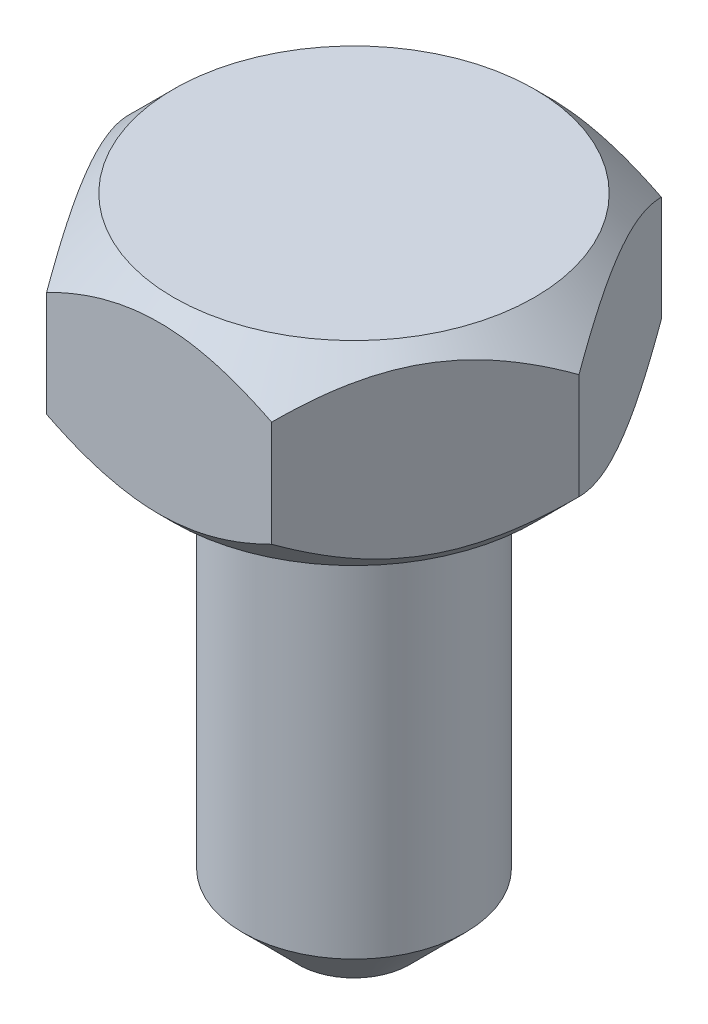
ISO-10303-21;
HEADER;
FILE_DESCRIPTION(('STEP AP214'),'2;1');
FILE_NAME('part.step','',(''),(''),'','','');
FILE_SCHEMA(('AUTOMOTIVE_DESIGN { 1 0 10303 214 1 1 1 1 }'));
ENDSEC;
DATA;
#1=APPLICATION_CONTEXT('core data for automotive mechanical design processes');
#2=APPLICATION_PROTOCOL_DEFINITION('international standard','automotive_design',2000,#1);
#3=PRODUCT_CONTEXT('',#1,'mechanical');
#4=PRODUCT('Part','Part','',(#3));
#5=PRODUCT_RELATED_PRODUCT_CATEGORY('part','',(#4));
#6=PRODUCT_DEFINITION_FORMATION('','',#4);
#7=PRODUCT_DEFINITION_CONTEXT('part definition',#1,'design');
#8=PRODUCT_DEFINITION('design','',#6,#7);
#9=PRODUCT_DEFINITION_SHAPE('','',#8);
#10=(LENGTH_UNIT() NAMED_UNIT(*) SI_UNIT(.MILLI.,.METRE.));
#11=(NAMED_UNIT(*) PLANE_ANGLE_UNIT() SI_UNIT($,.RADIAN.));
#12=(NAMED_UNIT(*) SI_UNIT($,.STERADIAN.) SOLID_ANGLE_UNIT());
#13=UNCERTAINTY_MEASURE_WITH_UNIT(LENGTH_MEASURE(1.E-05),#10,'distance_accuracy_value','');
#14=(GEOMETRIC_REPRESENTATION_CONTEXT(3) GLOBAL_UNCERTAINTY_ASSIGNED_CONTEXT((#13)) GLOBAL_UNIT_ASSIGNED_CONTEXT((#10,
#11,#12)) REPRESENTATION_CONTEXT('',''));
#15=CARTESIAN_POINT('',(0.,0.,0.));
#16=DIRECTION('',(0.,0.,1.));
#17=DIRECTION('',(1.,0.,0.));
#18=AXIS2_PLACEMENT_3D('',#15,#16,#17);
#19=CARTESIAN_POINT('',(-4.04145188432739,-3.5,0.));
#20=DIRECTION('',(0.,1.,0.));
#21=DIRECTION('',(0.,0.,1.));
#22=AXIS2_PLACEMENT_3D('',#19,#20,#21);
#23=PLANE('',#22);
#24=CARTESIAN_POINT('',(0.,-3.5,0.));
#25=DIRECTION('',(0.,1.,0.));
#26=DIRECTION('',(0.,0.,1.));
#27=AXIS2_PLACEMENT_3D('',#24,#25,#26);
#28=CIRCLE('',#27,3.24145188432739);
#29=CARTESIAN_POINT('',(0.,-3.5,3.24145188432739));
#30=VERTEX_POINT('',#29);
#31=EDGE_CURVE('E102',#30,#30,#28,.T.);
#32=ORIENTED_EDGE('',*,*,#31,.F.);
#33=EDGE_LOOP('',(#32));
#34=FACE_BOUND('',#33,.T.);
#35=CARTESIAN_POINT('',(0.,-3.5,0.));
#36=DIRECTION('',(0.,1.,0.));
#37=DIRECTION('',(0.,0.,1.));
#38=AXIS2_PLACEMENT_3D('',#35,#36,#37);
#39=CIRCLE('',#38,2.);
#40=CARTESIAN_POINT('',(0.,-3.5,2.));
#41=VERTEX_POINT('',#40);
#42=EDGE_CURVE('E117',#41,#41,#39,.F.);
#43=ORIENTED_EDGE('',*,*,#42,.F.);
#44=EDGE_LOOP('',(#43));
#45=FACE_BOUND('',#44,.T.);
#46=ADVANCED_FACE('F29',(#34,#45),#23,.F.);
#47=CARTESIAN_POINT('',(0.,-11.5,0.));
#48=DIRECTION('',(0.,1.,0.));
#49=DIRECTION('',(0.,0.,1.));
#50=AXIS2_PLACEMENT_3D('',#47,#48,#49);
#51=CYLINDRICAL_SURFACE('',#50,2.);
#52=CARTESIAN_POINT('',(0.,-10.5,0.));
#53=DIRECTION('',(0.,-1.,0.));
#54=DIRECTION('',(0.,0.,-1.));
#55=AXIS2_PLACEMENT_3D('',#52,#53,#54);
#56=CIRCLE('',#55,2.);
#57=CARTESIAN_POINT('',(0.,-10.5,-2.));
#58=VERTEX_POINT('',#57);
#59=EDGE_CURVE('E42',#58,#58,#56,.F.);
#60=ORIENTED_EDGE('',*,*,#59,.T.);
#61=EDGE_LOOP('',(#60));
#62=FACE_BOUND('',#61,.T.);
#63=ORIENTED_EDGE('',*,*,#42,.T.);
#64=EDGE_LOOP('',(#63));
#65=FACE_BOUND('',#64,.T.);
#66=ADVANCED_FACE('F126',(#62,#65),#51,.T.);
#67=CARTESIAN_POINT('',(0.,-11.5,0.));
#68=DIRECTION('',(0.,-1.,0.));
#69=DIRECTION('',(0.,0.,-1.));
#70=AXIS2_PLACEMENT_3D('',#67,#68,#69);
#71=PLANE('',#70);
#72=CARTESIAN_POINT('',(0.,-11.5,0.));
#73=DIRECTION('',(0.,-1.,0.));
#74=DIRECTION('',(0.,0.,-1.));
#75=AXIS2_PLACEMENT_3D('',#72,#73,#74);
#76=CIRCLE('',#75,0.999999999999999);
#77=CARTESIAN_POINT('',(0.,-11.5,-0.999999999999999));
#78=VERTEX_POINT('',#77);
#79=EDGE_CURVE('E120',#78,#78,#76,.T.);
#80=ORIENTED_EDGE('',*,*,#79,.T.);
#81=EDGE_LOOP('',(#80));
#82=FACE_BOUND('',#81,.T.);
#83=ADVANCED_FACE('F132',(#82),#71,.T.);
#84=CARTESIAN_POINT('',(0.,-11.5,0.));
#85=DIRECTION('',(0.,1.,0.));
#86=DIRECTION('',(0.,0.,1.));
#87=AXIS2_PLACEMENT_3D('',#84,#85,#86);
#88=CONICAL_SURFACE('',#87,0.999999999999999,0.785398163397447);
#89=ORIENTED_EDGE('',*,*,#59,.F.);
#90=EDGE_LOOP('',(#89));
#91=FACE_BOUND('',#90,.T.);
#92=ORIENTED_EDGE('',*,*,#79,.F.);
#93=EDGE_LOOP('',(#92));
#94=FACE_BOUND('',#93,.T.);
#95=ADVANCED_FACE('F129',(#91,#94),#88,.T.);
#96=CARTESIAN_POINT('',(0.,-3.5,0.));
#97=DIRECTION('',(0.,1.,0.));
#98=DIRECTION('',(0.,0.,1.));
#99=AXIS2_PLACEMENT_3D('',#96,#97,#98);
#100=CONICAL_SURFACE('',#99,3.24145188432739,0.785398163397448);
#101=CARTESIAN_POINT('',(-4.04156735438123,-2.69988452499759,0.000200000000024374));
#102=CARTESIAN_POINT('',(-3.97210706066971,-2.76928406626867,-0.120108757816985));
#103=CARTESIAN_POINT('',(-3.90148531215406,-2.83460752114448,-0.242429214365436));
#104=CARTESIAN_POINT('',(-3.75747991147154,-2.95421294831347,-0.491853884911885));
#105=CARTESIAN_POINT('',(-3.68408256574986,-3.00842837712061,-0.618981816842531));
#106=CARTESIAN_POINT('',(-3.53608035685404,-3.10130032476617,-0.875329162282505));
#107=CARTESIAN_POINT('',(-3.4615131811703,-3.14019025979249,-1.00448329914366));
#108=CARTESIAN_POINT('',(-3.310737295381,-3.20010809560693,-1.26563479388693));
#109=CARTESIAN_POINT('',(-3.2345331906662,-3.22118071965238,-1.39762417499826));
#110=CARTESIAN_POINT('',(-3.10319782183118,-3.24019388535166,-1.62510370665133));
#111=CARTESIAN_POINT('',(-3.04823615399914,-3.24300830014006,-1.72030010780514));
#112=CARTESIAN_POINT('',(-2.93840222621348,-3.23826531256006,-1.91053805112477));
#113=CARTESIAN_POINT('',(-2.88353000435282,-3.23070427424299,-2.00557952731161));
#114=CARTESIAN_POINT('',(-2.77430542200353,-3.20564210374561,-2.19476205337608));
#115=CARTESIAN_POINT('',(-2.71995371223669,-3.1881298536199,-2.28890197617048));
#116=CARTESIAN_POINT('',(-2.61218376551828,-3.14412110260569,-2.47556499941575));
#117=CARTESIAN_POINT('',(-2.55876545732786,-3.11762529053566,-2.56808822325595));
#118=CARTESIAN_POINT('',(-2.46393368006796,-3.06311203056568,-2.73234167964214));
#119=CARTESIAN_POINT('',(-2.42231028209656,-3.03652769615024,-2.80443551971227));
#120=CARTESIAN_POINT('',(-2.33981072759412,-2.97907462503668,-2.94732893971228));
#121=CARTESIAN_POINT('',(-2.29893459386685,-2.94820575783654,-3.01812848014491));
#122=CARTESIAN_POINT('',(-2.21805834837752,-2.88287565935588,-3.15821024645784));
#123=CARTESIAN_POINT('',(-2.17805593632086,-2.84842572434904,-3.22749645656527));
#124=CARTESIAN_POINT('',(-2.09879193666162,-2.77638590028467,-3.36478573118621));
#125=CARTESIAN_POINT('',(-2.05952991236256,-2.73879793793946,-3.43278955208019));
#126=CARTESIAN_POINT('',(-2.02061047210986,-2.69988452499759,-3.5002));
#127=B_SPLINE_CURVE_WITH_KNOTS('',3,(#101,#102,#103,#104,#105,#106,#107,#108,#109,#110,#111,
#112,#113,#114,#115,#116,#117,#118,#119,#120,#121,#122,#123,#124,#125,#126),.UNSPECIFIED.,.F.,
.F.,(4,2,2,2,2,2,2,2,2,2,2,2,4),(0.,0.466195029511836,0.93510605524767,1.39657035229711,
1.85687285909026,2.18628459516077,2.51581179896772,2.845707891424,3.17557869467338,
3.4376213889119,3.69967206642682,3.96091985737579,4.22200840855898),.UNSPECIFIED.);
#128=CARTESIAN_POINT('',(-4.04145188432739,-2.7,0.));
#129=VERTEX_POINT('',#128);
#130=CARTESIAN_POINT('',(-2.02072594216371,-2.7,-3.5));
#131=VERTEX_POINT('',#130);
#132=EDGE_CURVE('E177',#129,#131,#127,.T.);
#133=ORIENTED_EDGE('',*,*,#132,.T.);
#134=CARTESIAN_POINT('',(-4.11343909523356,-1.34049074854832,-3.5));
#135=CARTESIAN_POINT('',(-4.01364790461446,-1.41647576800568,-3.5));
#136=CARTESIAN_POINT('',(-3.91330741187747,-1.4917509457735,-3.5));
#137=CARTESIAN_POINT('',(-3.71130759190236,-1.64056086288985,-3.5));
#138=CARTESIAN_POINT('',(-3.60964794828074,-1.71409517230361,-3.5));
#139=CARTESIAN_POINT('',(-3.40404593483019,-1.85962589901091,-3.5));
#140=CARTESIAN_POINT('',(-3.30009198936034,-1.93160601709034,-3.5));
#141=CARTESIAN_POINT('',(-3.09043455319368,-2.07296300910746,-3.5));
#142=CARTESIAN_POINT('',(-2.98473118535169,-2.14234006473914,-3.5));
#143=CARTESIAN_POINT('',(-2.76489352426084,-2.28196781927053,-3.5));
#144=CARTESIAN_POINT('',(-2.65063360057755,-2.35202171786016,-3.5));
#145=CARTESIAN_POINT('',(-2.41943843809483,-2.48764015461377,-3.5));
#146=CARTESIAN_POINT('',(-2.30250276768208,-2.55320396159193,-3.5));
#147=CARTESIAN_POINT('',(-2.06594770908092,-2.6784356928961,-3.5));
#148=CARTESIAN_POINT('',(-1.94633756764447,-2.73812094705998,-3.5));
#149=CARTESIAN_POINT('',(-1.70380065325271,-2.85025883184051,-3.5));
#150=CARTESIAN_POINT('',(-1.58087544221088,-2.90271479977525,-3.5));
#151=CARTESIAN_POINT('',(-1.34256664054354,-2.99425414604565,-3.5));
#152=CARTESIAN_POINT('',(-1.22748347184254,-3.03411159832747,-3.5));
#153=CARTESIAN_POINT('',(-0.994473602956439,-3.10460445258339,-3.5));
#154=CARTESIAN_POINT('',(-0.876546714407832,-3.13523924184055,-3.5));
#155=CARTESIAN_POINT('',(-0.640555797612561,-3.18515136149643,-3.5));
#156=CARTESIAN_POINT('',(-0.522534731770002,-3.20462846737207,-3.5));
#157=CARTESIAN_POINT('',(-0.285138833258746,-3.23183388871137,-3.5));
#158=CARTESIAN_POINT('',(-0.165764258218942,-3.23956440343576,-3.5));
#159=CARTESIAN_POINT('',(0.0684345425591306,-3.24266430583436,-3.5));
#160=CARTESIAN_POINT('',(0.183252604656246,-3.23850904804464,-3.5));
#161=CARTESIAN_POINT('',(0.41194538139855,-3.21913596089254,-3.5));
#162=CARTESIAN_POINT('',(0.525820005903612,-3.20391708651605,-3.5));
#163=CARTESIAN_POINT('',(0.753728692005361,-3.16300182207144,-3.5));
#164=CARTESIAN_POINT('',(0.867729673651151,-3.13712416826838,-3.5));
#165=CARTESIAN_POINT('',(1.09323660944141,-3.07629621041035,-3.5));
#166=CARTESIAN_POINT('',(1.20474274230377,-3.04134655850057,-3.5));
#167=CARTESIAN_POINT('',(1.43351745819777,-2.96089193875029,-3.5));
#168=CARTESIAN_POINT('',(1.55057121674902,-2.91478260530312,-3.5));
#169=CARTESIAN_POINT('',(1.78163768388521,-2.81546896217881,-3.5));
#170=CARTESIAN_POINT('',(1.8956493792125,-2.76226232305919,-3.5));
#171=CARTESIAN_POINT('',(2.12120309504484,-2.65000927106598,-3.5));
#172=CARTESIAN_POINT('',(2.23273581617762,-2.59094432351664,-3.5));
#173=CARTESIAN_POINT('',(2.45323999840432,-2.46828035973536,-3.5));
#174=CARTESIAN_POINT('',(2.56221185705048,-2.40468205353482,-3.5));
#175=CARTESIAN_POINT('',(2.77258648527557,-2.27708230144591,-3.5));
#176=CARTESIAN_POINT('',(2.87409670716152,-2.21325707762329,-3.5));
#177=CARTESIAN_POINT('',(3.07537374659972,-2.08290631812229,-3.5));
#178=CARTESIAN_POINT('',(3.17514043189724,-2.01638057885912,-3.5));
#179=CARTESIAN_POINT('',(3.37235277259435,-1.88165662424084,-3.5));
#180=CARTESIAN_POINT('',(3.46981066719971,-1.81347626064957,-3.5));
#181=CARTESIAN_POINT('',(3.66339199507936,-1.67530022312019,-3.5));
#182=CARTESIAN_POINT('',(3.75951578844138,-1.60530505424452,-3.5));
#183=CARTESIAN_POINT('',(3.85508044256854,-1.53456747820942,-3.5));
#184=B_SPLINE_CURVE_WITH_KNOTS('',3,(#134,#135,#136,#137,#138,#139,#140,#141,#142,#143,#144,
#145,#146,#147,#148,#149,#150,#151,#152,#153,#154,#155,#156,#157,#158,#159,#160,#161,#162,#163,
#164,#165,#166,#167,#168,#169,#170,#171,#172,#173,#174,#175,#176,#177,#178,#179,#180,#181,#182,
#183),.UNSPECIFIED.,.F.,.F.,(4,2,2,2,2,2,2,2,2,2,2,2,2,2,2,2,2,2,2,2,2,2,2,2,4),(0.,
0.376289066832934,0.752670114666427,1.13196303882771,1.51122943887124,1.91322439656266,
2.31528466194431,2.71612176675466,3.11677320534959,3.48182442073459,3.84689988331699,
4.20521619183289,4.56346540614943,4.90758964289977,5.25174638813573,5.60201478075691,
5.95225800112648,6.32939036689254,6.70664681914763,7.08513741857289,7.46356886710629,
7.82324340751906,8.18294511339456,8.53974109313966,8.89643881996947),.UNSPECIFIED.);
#185=CARTESIAN_POINT('',(2.02072594216368,-2.7,-3.50000000000001));
#186=VERTEX_POINT('',#185);
#187=EDGE_CURVE('E171',#131,#186,#184,.T.);
#188=ORIENTED_EDGE('',*,*,#187,.T.);
#189=CARTESIAN_POINT('',(2.02061047210985,-2.69988452499759,-3.5002));
#190=CARTESIAN_POINT('',(2.09007076582137,-2.76928406626868,-3.37989124218299));
#191=CARTESIAN_POINT('',(2.16069251433702,-2.83460752114448,-3.25757078563454));
#192=CARTESIAN_POINT('',(2.30469791501954,-2.95421294831348,-3.00814611508809));
#193=CARTESIAN_POINT('',(2.37809526074122,-3.00842837712062,-2.88101818315745));
#194=CARTESIAN_POINT('',(2.52609746963704,-3.10130032476618,-2.62467083771748));
#195=CARTESIAN_POINT('',(2.60066464532078,-3.14019025979249,-2.49551670085632));
#196=CARTESIAN_POINT('',(2.75144053111008,-3.20010809560693,-2.23436520611305));
#197=CARTESIAN_POINT('',(2.82764463582487,-3.22118071965239,-2.10237582500172));
#198=CARTESIAN_POINT('',(2.9589800046599,-3.24019388535166,-1.87489629334866));
#199=CARTESIAN_POINT('',(3.01394167249194,-3.24300830014006,-1.77969989219485));
#200=CARTESIAN_POINT('',(3.1237756002776,-3.23826531256006,-1.58946194887522));
#201=CARTESIAN_POINT('',(3.17864782213825,-3.230704274243,-1.49442047268838));
#202=CARTESIAN_POINT('',(3.28787240448755,-3.20564210374561,-1.30523794662391));
#203=CARTESIAN_POINT('',(3.34222411425439,-3.1881298536199,-1.21109802382951));
#204=CARTESIAN_POINT('',(3.4499940609728,-3.14412110260569,-1.02443500058424));
#205=CARTESIAN_POINT('',(3.50341236916322,-3.11762529053566,-0.931911776744044));
#206=CARTESIAN_POINT('',(3.59824414642312,-3.06311203056568,-0.767658320357851));
#207=CARTESIAN_POINT('',(3.63986754439452,-3.03652769615024,-0.695564480287724));
#208=CARTESIAN_POINT('',(3.72236709889696,-2.97907462503668,-0.552671060287705));
#209=CARTESIAN_POINT('',(3.76324323262423,-2.94820575783654,-0.48187151985508));
#210=CARTESIAN_POINT('',(3.84411947811356,-2.88287565935588,-0.34178975354215));
#211=CARTESIAN_POINT('',(3.88412189017022,-2.84842572434904,-0.272503543434717));
#212=CARTESIAN_POINT('',(3.96338588982947,-2.77638590028467,-0.135214268813778));
#213=CARTESIAN_POINT('',(4.00264791412853,-2.73879793793945,-0.0672104479197994));
#214=CARTESIAN_POINT('',(4.04156735438122,-2.69988452499759,0.000200000000013168));
#215=B_SPLINE_CURVE_WITH_KNOTS('',3,(#189,#190,#191,#192,#193,#194,#195,#196,#197,#198,#199,
#200,#201,#202,#203,#204,#205,#206,#207,#208,#209,#210,#211,#212,#213,#214),.UNSPECIFIED.,.F.,
.F.,(4,2,2,2,2,2,2,2,2,2,2,2,4),(0.,0.466195029511833,0.935106055247664,1.3965703522971,
1.85687285909024,2.18628459516076,2.51581179896771,2.84570789142399,3.17557869467336,
3.43762138891188,3.69967206642681,3.96091985737578,4.22200840855897),.UNSPECIFIED.);
#216=CARTESIAN_POINT('',(4.04145188432739,-2.7,0.));
#217=VERTEX_POINT('',#216);
#218=EDGE_CURVE('E90',#186,#217,#215,.T.);
#219=ORIENTED_EDGE('',*,*,#218,.T.);
#220=CARTESIAN_POINT('',(4.04156735438122,-2.69988452499759,-0.000199999999987047));
#221=CARTESIAN_POINT('',(3.9721070606697,-2.76928406626868,0.120108757817022));
#222=CARTESIAN_POINT('',(3.90148531215406,-2.83460752114448,0.242429214365472));
#223=CARTESIAN_POINT('',(3.75747991147153,-2.95421294831348,0.491853884911919));
#224=CARTESIAN_POINT('',(3.68408256574985,-3.00842837712061,0.618981816842565));
#225=CARTESIAN_POINT('',(3.53608035685403,-3.10130032476617,0.875329162282538));
#226=CARTESIAN_POINT('',(3.46151318117029,-3.14019025979249,1.00448329914369));
#227=CARTESIAN_POINT('',(3.31073729538099,-3.20010809560693,1.26563479388696));
#228=CARTESIAN_POINT('',(3.23453319066619,-3.22118071965239,1.39762417499829));
#229=CARTESIAN_POINT('',(3.10319782183116,-3.24019388535166,1.62510370665136));
#230=CARTESIAN_POINT('',(3.04823615399913,-3.24300830014006,1.72030010780516));
#231=CARTESIAN_POINT('',(2.93840222621346,-3.23826531256006,1.91053805112479));
#232=CARTESIAN_POINT('',(2.88353000435281,-3.230704274243,2.00557952731163));
#233=CARTESIAN_POINT('',(2.77430542200351,-3.20564210374561,2.19476205337611));
#234=CARTESIAN_POINT('',(2.71995371223667,-3.1881298536199,2.2889019761705));
#235=CARTESIAN_POINT('',(2.61218376551826,-3.14412110260569,2.47556499941577));
#236=CARTESIAN_POINT('',(2.55876545732783,-3.11762529053566,2.56808822325597));
#237=CARTESIAN_POINT('',(2.46393368006794,-3.06311203056568,2.73234167964216));
#238=CARTESIAN_POINT('',(2.42231028209654,-3.03652769615024,2.80443551971228));
#239=CARTESIAN_POINT('',(2.3398107275941,-2.97907462503668,2.9473289397123));
#240=CARTESIAN_POINT('',(2.29893459386683,-2.94820575783654,3.01812848014492));
#241=CARTESIAN_POINT('',(2.2180583483775,-2.88287565935588,3.15821024645785));
#242=CARTESIAN_POINT('',(2.17805593632084,-2.84842572434904,3.22749645656528));
#243=CARTESIAN_POINT('',(2.0987919366616,-2.77638590028468,3.36478573118621));
#244=CARTESIAN_POINT('',(2.05952991236254,-2.73879793793947,3.43278955208019));
#245=CARTESIAN_POINT('',(2.02061047210984,-2.6998845249976,3.5002));
#246=B_SPLINE_CURVE_WITH_KNOTS('',3,(#220,#221,#222,#223,#224,#225,#226,#227,#228,#229,#230,
#231,#232,#233,#234,#235,#236,#237,#238,#239,#240,#241,#242,#243,#244,#245),.UNSPECIFIED.,.F.,
.F.,(4,2,2,2,2,2,2,2,2,2,2,2,4),(0.,0.466195029511836,0.93510605524767,1.39657035229711,
1.85687285909025,2.18628459516077,2.51581179896772,2.845707891424,3.17557869467337,
3.43762138891189,3.69967206642681,3.96091985737577,4.22200840855895),.UNSPECIFIED.);
#247=CARTESIAN_POINT('',(2.02072594216371,-2.7,3.5));
#248=VERTEX_POINT('',#247);
#249=EDGE_CURVE('E86',#217,#248,#246,.T.);
#250=ORIENTED_EDGE('',*,*,#249,.T.);
#251=CARTESIAN_POINT('',(-4.11343909532792,-1.34049074847645,3.5));
#252=CARTESIAN_POINT('',(-4.01364790470614,-1.41647576793658,3.5));
#253=CARTESIAN_POINT('',(-3.91330741196645,-1.49175094570717,3.5));
#254=CARTESIAN_POINT('',(-3.71130759198594,-1.64056086282906,3.5));
#255=CARTESIAN_POINT('',(-3.6096479483616,-1.71409517224557,3.5));
#256=CARTESIAN_POINT('',(-3.40404593490552,-1.8596258989584,3.5));
#257=CARTESIAN_POINT('',(-3.30009198943286,-1.9316060170406,3.5));
#258=CARTESIAN_POINT('',(-3.09043455326054,-2.07296300906322,3.5));
#259=CARTESIAN_POINT('',(-2.98473118541569,-2.14234006469764,3.5));
#260=CARTESIAN_POINT('',(-2.76489352431867,-2.28196781923471,3.5));
#261=CARTESIAN_POINT('',(-2.65063360063206,-2.35202171782728,3.5));
#262=CARTESIAN_POINT('',(-2.41943843814258,-2.48764015458666,3.5));
#263=CARTESIAN_POINT('',(-2.3025027677264,-2.55320396156762,3.5));
#264=CARTESIAN_POINT('',(-2.06594770911824,-2.67843569287718,3.5));
#265=CARTESIAN_POINT('',(-1.94633756767823,-2.73812094704364,3.5));
#266=CARTESIAN_POINT('',(-1.70380065327916,-2.85025883182901,3.5));
#267=CARTESIAN_POINT('',(-1.58087544223358,-2.902714799766,3.5));
#268=CARTESIAN_POINT('',(-1.34256664056464,-2.99425414603802,3.5));
#269=CARTESIAN_POINT('',(-1.22748347186597,-3.03411159831963,3.5));
#270=CARTESIAN_POINT('',(-0.994473602984598,-3.10460445257561,3.5));
#271=CARTESIAN_POINT('',(-0.876546714438396,-3.13523924183304,3.5));
#272=CARTESIAN_POINT('',(-0.640555797647857,-3.18515136148999,3.5));
#273=CARTESIAN_POINT('',(-0.522534731807625,-3.20462846736643,3.5));
#274=CARTESIAN_POINT('',(-0.285138833300951,-3.23183388870786,3.5));
#275=CARTESIAN_POINT('',(-0.165764258263403,-3.23956440343358,3.5));
#276=CARTESIAN_POINT('',(0.0684345425106541,-3.24266430583524,3.5));
#277=CARTESIAN_POINT('',(0.183252604606004,-3.23850904804722,3.5));
#278=CARTESIAN_POINT('',(0.411945381344963,-3.21913596089876,3.5));
#279=CARTESIAN_POINT('',(0.525820005848445,-3.20391708652421,3.5));
#280=CARTESIAN_POINT('',(0.753728691947076,-3.16300182208367,3.5));
#281=CARTESIAN_POINT('',(0.867729673591332,-3.13712416828275,3.5));
#282=CARTESIAN_POINT('',(1.09323660937868,-3.07629621042903,3.5));
#283=CARTESIAN_POINT('',(1.20474274223966,-3.04134655852143,3.5));
#284=CARTESIAN_POINT('',(1.4335174581261,-2.96089193877731,3.5));
#285=CARTESIAN_POINT('',(1.5505712166713,-2.9147826053345,3.5));
#286=CARTESIAN_POINT('',(1.78163768379569,-2.81546896221932,3.5));
#287=CARTESIAN_POINT('',(1.89564937911723,-2.76226232310448,3.5));
#288=CARTESIAN_POINT('',(2.12120309493829,-2.65000927112113,3.5));
#289=CARTESIAN_POINT('',(2.23273581606554,-2.59094432357686,3.5));
#290=CARTESIAN_POINT('',(2.45323999828135,-2.46828035980589,3.5));
#291=CARTESIAN_POINT('',(2.56221185692215,-2.40468205361059,3.5));
#292=CARTESIAN_POINT('',(2.77258648513752,-2.27708230153161,3.5));
#293=CARTESIAN_POINT('',(2.87409670701908,-2.21325707771367,3.5));
#294=CARTESIAN_POINT('',(3.07537374644856,-2.08290631822205,3.5));
#295=CARTESIAN_POINT('',(3.17514043174175,-2.01638057896358,3.5));
#296=CARTESIAN_POINT('',(3.37235277243031,-1.88165662435465,3.5));
#297=CARTESIAN_POINT('',(3.46981066703145,-1.81347626076803,3.5));
#298=CARTESIAN_POINT('',(3.66339199490269,-1.67530022324793,3.5));
#299=CARTESIAN_POINT('',(3.75951578826051,-1.60530505437691,3.5));
#300=CARTESIAN_POINT('',(3.85508044238348,-1.53456747834644,3.5));
#301=B_SPLINE_CURVE_WITH_KNOTS('',3,(#251,#252,#253,#254,#255,#256,#257,#258,#259,#260,#261,
#262,#263,#264,#265,#266,#267,#268,#269,#270,#271,#272,#273,#274,#275,#276,#277,#278,#279,#280,
#281,#282,#283,#284,#285,#286,#287,#288,#289,#290,#291,#292,#293,#294,#295,#296,#297,#298,#299,
#300),.UNSPECIFIED.,.F.,.F.,(4,2,2,2,2,2,2,2,2,2,2,2,2,2,2,2,2,2,2,2,2,2,2,2,4),(0.,
0.376289066844382,0.752670114689327,1.13196303886228,1.51122943891747,1.91322439662199,
2.31528466201676,2.7161217668401,3.11677320544801,3.48182442082625,3.84689988340191,
4.20521619191135,4.56346540622143,4.90758964296631,5.25174638819682,5.60201478081209,
5.95225800117576,6.32939036692017,6.70664681915359,7.08513741855706,7.46356886706867,
7.82324340746283,8.1829451133197,8.53974109304643,8.89643881985787),.UNSPECIFIED.);
#302=CARTESIAN_POINT('',(-2.02072594216367,-2.70000000000002,3.5));
#303=VERTEX_POINT('',#302);
#304=EDGE_CURVE('E48',#248,#303,#301,.F.);
#305=ORIENTED_EDGE('',*,*,#304,.T.);
#306=CARTESIAN_POINT('',(-2.02061047210983,-2.69988452499761,3.5002));
#307=CARTESIAN_POINT('',(-2.09007076582135,-2.76928406626869,3.37989124218299));
#308=CARTESIAN_POINT('',(-2.160692514337,-2.83460752114449,3.25757078563455));
#309=CARTESIAN_POINT('',(-2.30469791501952,-2.95421294831349,3.0081461150881));
#310=CARTESIAN_POINT('',(-2.3780952607412,-3.00842837712062,2.88101818315746));
#311=CARTESIAN_POINT('',(-2.52609746963702,-3.10130032476618,2.62467083771749));
#312=CARTESIAN_POINT('',(-2.60066464532076,-3.14019025979249,2.49551670085634));
#313=CARTESIAN_POINT('',(-2.75144053111006,-3.20010809560693,2.23436520611307));
#314=CARTESIAN_POINT('',(-2.82764463582486,-3.22118071965239,2.10237582500175));
#315=CARTESIAN_POINT('',(-2.95898000465988,-3.24019388535166,1.87489629334868));
#316=CARTESIAN_POINT('',(-3.01394167249192,-3.24300830014006,1.77969989219488));
#317=CARTESIAN_POINT('',(-3.12377560027759,-3.23826531256006,1.58946194887525));
#318=CARTESIAN_POINT('',(-3.17864782213824,-3.23070427424299,1.49442047268841));
#319=CARTESIAN_POINT('',(-3.28787240448754,-3.20564210374561,1.30523794662394));
#320=CARTESIAN_POINT('',(-3.34222411425438,-3.1881298536199,1.21109802382954));
#321=CARTESIAN_POINT('',(-3.44999406097279,-3.14412110260569,1.02443500058427));
#322=CARTESIAN_POINT('',(-3.50341236916322,-3.11762529053566,0.931911776744076));
#323=CARTESIAN_POINT('',(-3.59824414642311,-3.06311203056568,0.767658320357883));
#324=CARTESIAN_POINT('',(-3.63986754439451,-3.03652769615024,0.695564480287757));
#325=CARTESIAN_POINT('',(-3.72236709889695,-2.97907462503668,0.552671060287739));
#326=CARTESIAN_POINT('',(-3.76324323262423,-2.94820575783654,0.481871519855115));
#327=CARTESIAN_POINT('',(-3.84411947811356,-2.88287565935587,0.341789753542185));
#328=CARTESIAN_POINT('',(-3.88412189017022,-2.84842572434903,0.272503543434753));
#329=CARTESIAN_POINT('',(-3.96338588982947,-2.77638590028466,0.135214268813814));
#330=CARTESIAN_POINT('',(-4.00264791412853,-2.73879793793945,0.0672104479198363));
#331=CARTESIAN_POINT('',(-4.04156735438123,-2.69988452499759,-0.000199999999975872));
#332=B_SPLINE_CURVE_WITH_KNOTS('',3,(#306,#307,#308,#309,#310,#311,#312,#313,#314,#315,#316,
#317,#318,#319,#320,#321,#322,#323,#324,#325,#326,#327,#328,#329,#330,#331),.UNSPECIFIED.,.F.,
.F.,(4,2,2,2,2,2,2,2,2,2,2,2,4),(0.,0.466195029511828,0.935106055247654,1.39657035229708,
1.85687285909022,2.18628459516074,2.51581179896768,2.84570789142397,3.17557869467334,
3.43762138891186,3.69967206642679,3.96091985737576,4.22200840855895),.UNSPECIFIED.);
#333=EDGE_CURVE('E11',#303,#129,#332,.T.);
#334=ORIENTED_EDGE('',*,*,#333,.T.);
#335=EDGE_LOOP('',(#133,#188,#219,#250,#305,#334));
#336=FACE_BOUND('',#335,.T.);
#337=ORIENTED_EDGE('',*,*,#31,.T.);
#338=EDGE_LOOP('',(#337));
#339=FACE_BOUND('',#338,.T.);
#340=ADVANCED_FACE('F87',(#336,#339),#100,.T.);
#341=CARTESIAN_POINT('',(-4.04145188432739,0.,0.));
#342=DIRECTION('',(0.,1.,0.));
#343=DIRECTION('',(0.,0.,1.));
#344=AXIS2_PLACEMENT_3D('',#341,#342,#343);
#345=PLANE('',#344);
#346=CARTESIAN_POINT('',(0.,0.,0.));
#347=DIRECTION('',(0.,1.,0.));
#348=DIRECTION('',(0.,0.,1.));
#349=AXIS2_PLACEMENT_3D('',#346,#347,#348);
#350=CIRCLE('',#349,3.24145188432739);
#351=CARTESIAN_POINT('',(0.,0.,3.24145188432739));
#352=VERTEX_POINT('',#351);
#353=EDGE_CURVE('E234',#352,#352,#350,.T.);
#354=ORIENTED_EDGE('',*,*,#353,.T.);
#355=EDGE_LOOP('',(#354));
#356=FACE_BOUND('',#355,.T.);
#357=ADVANCED_FACE('F152',(#356),#345,.T.);
#358=CARTESIAN_POINT('',(0.,-0.8,0.));
#359=DIRECTION('',(0.,-1.,0.));
#360=DIRECTION('',(0.,0.,-1.));
#361=AXIS2_PLACEMENT_3D('',#358,#359,#360);
#362=CONICAL_SURFACE('',#361,4.04145188432739,0.785398163397448);
#363=CARTESIAN_POINT('',(-2.02061047210986,-0.800115475002408,-3.5002));
#364=CARTESIAN_POINT('',(-2.09007076582138,-0.730715933731321,-3.37989124218299));
#365=CARTESIAN_POINT('',(-2.16069251433702,-0.665392478855521,-3.25757078563454));
#366=CARTESIAN_POINT('',(-2.30469791501955,-0.545787051686524,-3.00814611508809));
#367=CARTESIAN_POINT('',(-2.37809526074123,-0.491571622879386,-2.88101818315745));
#368=CARTESIAN_POINT('',(-2.52609746963704,-0.398699675233827,-2.62467083771747));
#369=CARTESIAN_POINT('',(-2.60066464532078,-0.359809740207512,-2.49551670085632));
#370=CARTESIAN_POINT('',(-2.75144053111008,-0.299891904393072,-2.23436520611305));
#371=CARTESIAN_POINT('',(-2.82764463582488,-0.278819280347616,-2.10237582500172));
#372=CARTESIAN_POINT('',(-2.95898000465991,-0.259806114648342,-1.87489629334865));
#373=CARTESIAN_POINT('',(-3.01394167249194,-0.256991699859938,-1.77969989219485));
#374=CARTESIAN_POINT('',(-3.12377560027761,-0.261734687439937,-1.58946194887522));
#375=CARTESIAN_POINT('',(-3.17864782213826,-0.269295725757006,-1.49442047268838));
#376=CARTESIAN_POINT('',(-3.28787240448756,-0.294357896254393,-1.3052379466239));
#377=CARTESIAN_POINT('',(-3.34222411425439,-0.311870146380099,-1.2110980238295));
#378=CARTESIAN_POINT('',(-3.4499940609728,-0.355878897394313,-1.02443500058423));
#379=CARTESIAN_POINT('',(-3.50341236916323,-0.382374709464336,-0.931911776744037));
#380=CARTESIAN_POINT('',(-3.59824414642312,-0.436887969434318,-0.767658320357844));
#381=CARTESIAN_POINT('',(-3.63986754439452,-0.463472303849764,-0.695564480287717));
#382=CARTESIAN_POINT('',(-3.72236709889696,-0.520925374963324,-0.552671060287697));
#383=CARTESIAN_POINT('',(-3.76324323262424,-0.551794242163462,-0.481871519855072));
#384=CARTESIAN_POINT('',(-3.84411947811357,-0.617124340644127,-0.34178975354214));
#385=CARTESIAN_POINT('',(-3.88412189017022,-0.651574275650966,-0.272503543434707));
#386=CARTESIAN_POINT('',(-3.96338588982947,-0.723614099715335,-0.135214268813767));
#387=CARTESIAN_POINT('',(-4.00264791412853,-0.761202062060548,-0.0672104479197882));
#388=CARTESIAN_POINT('',(-4.04156735438123,-0.800115475002413,0.000200000000024814));
#389=B_SPLINE_CURVE_WITH_KNOTS('',3,(#363,#364,#365,#366,#367,#368,#369,#370,#371,#372,#373,
#374,#375,#376,#377,#378,#379,#380,#381,#382,#383,#384,#385,#386,#387,#388),.UNSPECIFIED.,.F.,
.F.,(4,2,2,2,2,2,2,2,2,2,2,2,4),(0.,0.466195029511835,0.935106055247666,1.3965703522971,
1.85687285909025,2.18628459516076,2.51581179896771,2.84570789142399,3.17557869467337,
3.43762138891189,3.69967206642682,3.96091985737579,4.22200840855898),.UNSPECIFIED.);
#390=CARTESIAN_POINT('',(-2.02072594216371,-0.8,-3.5));
#391=VERTEX_POINT('',#390);
#392=CARTESIAN_POINT('',(-4.04145188432739,-0.8,0.));
#393=VERTEX_POINT('',#392);
#394=EDGE_CURVE('E116',#391,#393,#389,.T.);
#395=ORIENTED_EDGE('',*,*,#394,.T.);
#396=CARTESIAN_POINT('',(-4.04156735438123,-0.800115475002413,-0.000199999999975714));
#397=CARTESIAN_POINT('',(-3.97210706066971,-0.730715933731325,0.120108757817033));
#398=CARTESIAN_POINT('',(-3.90148531215406,-0.665392478855525,0.242429214365483));
#399=CARTESIAN_POINT('',(-3.75747991147153,-0.545787051686527,0.491853884911931));
#400=CARTESIAN_POINT('',(-3.68408256574985,-0.491571622879388,0.618981816842576));
#401=CARTESIAN_POINT('',(-3.53608035685403,-0.398699675233828,0.875329162282549));
#402=CARTESIAN_POINT('',(-3.46151318117029,-0.359809740207512,1.00448329914371));
#403=CARTESIAN_POINT('',(-3.31073729538099,-0.299891904393072,1.26563479388697));
#404=CARTESIAN_POINT('',(-3.23453319066619,-0.278819280347615,1.3976241749983));
#405=CARTESIAN_POINT('',(-3.10319782183116,-0.259806114648341,1.62510370665137));
#406=CARTESIAN_POINT('',(-3.04823615399912,-0.256991699859937,1.72030010780518));
#407=CARTESIAN_POINT('',(-2.93840222621345,-0.261734687439936,1.9105380511248));
#408=CARTESIAN_POINT('',(-2.8835300043528,-0.269295725757005,2.00557952731164));
#409=CARTESIAN_POINT('',(-2.7743054220035,-0.294357896254393,2.19476205337612));
#410=CARTESIAN_POINT('',(-2.71995371223666,-0.311870146380099,2.28890197617051));
#411=CARTESIAN_POINT('',(-2.61218376551825,-0.355878897394312,2.47556499941578));
#412=CARTESIAN_POINT('',(-2.55876545732782,-0.382374709464335,2.56808822325598));
#413=CARTESIAN_POINT('',(-2.46393368006793,-0.436887969434316,2.73234167964217));
#414=CARTESIAN_POINT('',(-2.42231028209653,-0.463472303849761,2.80443551971229));
#415=CARTESIAN_POINT('',(-2.33981072759409,-0.520925374963318,2.9473289397123));
#416=CARTESIAN_POINT('',(-2.29893459386682,-0.551794242163455,3.01812848014493));
#417=CARTESIAN_POINT('',(-2.21805834837749,-0.617124340644116,3.15821024645785));
#418=CARTESIAN_POINT('',(-2.17805593632083,-0.651574275650953,3.22749645656528));
#419=CARTESIAN_POINT('',(-2.09879193666159,-0.723614099715318,3.36478573118622));
#420=CARTESIAN_POINT('',(-2.05952991236253,-0.76120206206053,3.43278955208019));
#421=CARTESIAN_POINT('',(-2.02061047210983,-0.800115475002393,3.5002));
#422=B_SPLINE_CURVE_WITH_KNOTS('',3,(#396,#397,#398,#399,#400,#401,#402,#403,#404,#405,#406,
#407,#408,#409,#410,#411,#412,#413,#414,#415,#416,#417,#418,#419,#420,#421),.UNSPECIFIED.,.F.,
.F.,(4,2,2,2,2,2,2,2,2,2,2,2,4),(0.,0.466195029511837,0.935106055247671,1.39657035229711,
1.85687285909026,2.18628459516077,2.51581179896772,2.84570789142401,3.17557869467338,
3.43762138891189,3.69967206642681,3.96091985737576,4.22200840855895),.UNSPECIFIED.);
#423=CARTESIAN_POINT('',(-2.02072594216365,-0.8,3.50000000000003));
#424=VERTEX_POINT('',#423);
#425=EDGE_CURVE('E237',#393,#424,#422,.T.);
#426=ORIENTED_EDGE('',*,*,#425,.T.);
#427=CARTESIAN_POINT('',(-4.11343909532793,-2.15950925152355,3.5));
#428=CARTESIAN_POINT('',(-4.01364790470614,-2.08352423206342,3.5));
#429=CARTESIAN_POINT('',(-3.91330741196646,-2.00824905429283,3.5));
#430=CARTESIAN_POINT('',(-3.71130759198594,-1.85943913717094,3.5));
#431=CARTESIAN_POINT('',(-3.60964794836161,-1.78590482775443,3.5));
#432=CARTESIAN_POINT('',(-3.40404593490553,-1.6403741010416,3.5));
#433=CARTESIAN_POINT('',(-3.30009198943287,-1.5683939829594,3.5));
#434=CARTESIAN_POINT('',(-3.09043455326054,-1.42703699093678,3.5));
#435=CARTESIAN_POINT('',(-2.98473118541569,-1.35765993530236,3.5));
#436=CARTESIAN_POINT('',(-2.76489352431867,-1.21803218076529,3.5));
#437=CARTESIAN_POINT('',(-2.65063360063206,-1.14797828217272,3.5));
#438=CARTESIAN_POINT('',(-2.41943843814258,-1.01235984541334,3.5));
#439=CARTESIAN_POINT('',(-2.3025027677264,-0.946796038432376,3.5));
#440=CARTESIAN_POINT('',(-2.06594770911824,-0.82156430712282,3.5));
#441=CARTESIAN_POINT('',(-1.94633756767823,-0.761879052956364,3.5));
#442=CARTESIAN_POINT('',(-1.70380065327916,-0.649741168170993,3.5));
#443=CARTESIAN_POINT('',(-1.58087544223358,-0.597285200233999,3.5));
#444=CARTESIAN_POINT('',(-1.34256664056464,-0.505745853961981,3.5));
#445=CARTESIAN_POINT('',(-1.22748347186597,-0.465888401680367,3.5));
#446=CARTESIAN_POINT('',(-0.994473602984597,-0.395395547424385,3.5));
#447=CARTESIAN_POINT('',(-0.876546714438396,-0.364760758166964,3.5));
#448=CARTESIAN_POINT('',(-0.640555797647857,-0.314848638510007,3.5));
#449=CARTESIAN_POINT('',(-0.522534731807625,-0.295371532633568,3.5));
#450=CARTESIAN_POINT('',(-0.285138833300952,-0.268166111292142,3.5));
#451=CARTESIAN_POINT('',(-0.165764258263404,-0.260435596566415,3.5));
#452=CARTESIAN_POINT('',(0.0684345425106533,-0.257335694164756,3.5));
#453=CARTESIAN_POINT('',(0.183252604606004,-0.261490951952784,3.5));
#454=CARTESIAN_POINT('',(0.411945381344962,-0.280864039101239,3.5));
#455=CARTESIAN_POINT('',(0.525820005848444,-0.29608291347579,3.5));
#456=CARTESIAN_POINT('',(0.753728691947075,-0.336998177916329,3.5));
#457=CARTESIAN_POINT('',(0.867729673591331,-0.362875831717248,3.5));
#458=CARTESIAN_POINT('',(1.09323660937868,-0.423703789570965,3.5));
#459=CARTESIAN_POINT('',(1.20474274223966,-0.458653441478571,3.5));
#460=CARTESIAN_POINT('',(1.43351745812609,-0.539108061222685,3.5));
#461=CARTESIAN_POINT('',(1.5505712166713,-0.585217394665504,3.5));
#462=CARTESIAN_POINT('',(1.78163768379568,-0.684531037780684,3.5));
#463=CARTESIAN_POINT('',(1.89564937911723,-0.737737676895517,3.5));
#464=CARTESIAN_POINT('',(2.12120309493829,-0.849990728878866,3.5));
#465=CARTESIAN_POINT('',(2.23273581606554,-0.909055676423135,3.5));
#466=CARTESIAN_POINT('',(2.45323999828134,-1.03171964019411,3.5));
#467=CARTESIAN_POINT('',(2.56221185692215,-1.09531794638941,3.5));
#468=CARTESIAN_POINT('',(2.77258648513752,-1.22291769846839,3.5));
#469=CARTESIAN_POINT('',(2.87409670701908,-1.28674292228633,3.5));
#470=CARTESIAN_POINT('',(3.07537374644856,-1.41709368177794,3.5));
#471=CARTESIAN_POINT('',(3.17514043174175,-1.48361942103641,3.5));
#472=CARTESIAN_POINT('',(3.37235277243031,-1.61834337564535,3.5));
#473=CARTESIAN_POINT('',(3.46981066703144,-1.68652373923197,3.5));
#474=CARTESIAN_POINT('',(3.66339199490268,-1.82469977675207,3.5));
#475=CARTESIAN_POINT('',(3.75951578826051,-1.89469494562309,3.5));
#476=CARTESIAN_POINT('',(3.85508044238347,-1.96543252165356,3.5));
#477=B_SPLINE_CURVE_WITH_KNOTS('',3,(#427,#428,#429,#430,#431,#432,#433,#434,#435,#436,#437,
#438,#439,#440,#441,#442,#443,#444,#445,#446,#447,#448,#449,#450,#451,#452,#453,#454,#455,#456,
#457,#458,#459,#460,#461,#462,#463,#464,#465,#466,#467,#468,#469,#470,#471,#472,#473,#474,#475,
#476),.UNSPECIFIED.,.F.,.F.,(4,2,2,2,2,2,2,2,2,2,2,2,2,2,2,2,2,2,2,2,2,2,2,2,4),(0.,
0.376289066844383,0.752670114689328,1.13196303886228,1.51122943891747,1.91322439662199,
2.31528466201676,2.7161217668401,3.11677320544801,3.48182442082626,3.84689988340191,
4.20521619191135,4.56346540622143,4.90758964296631,5.25174638819682,5.60201478081209,
5.95225800117577,6.32939036692017,6.70664681915359,7.08513741855706,7.46356886706867,
7.82324340746282,8.1829451133197,8.53974109304643,8.89643881985787),.UNSPECIFIED.);
#478=CARTESIAN_POINT('',(2.02072594216371,-0.8,3.5));
#479=VERTEX_POINT('',#478);
#480=EDGE_CURVE('E211',#424,#479,#477,.T.);
#481=ORIENTED_EDGE('',*,*,#480,.T.);
#482=CARTESIAN_POINT('',(2.02061047210984,-0.800115475002398,3.5002));
#483=CARTESIAN_POINT('',(2.09007076582136,-0.730715933731311,3.37989124218299));
#484=CARTESIAN_POINT('',(2.160692514337,-0.665392478855513,3.25757078563454));
#485=CARTESIAN_POINT('',(2.30469791501953,-0.545787051686518,3.0081461150881));
#486=CARTESIAN_POINT('',(2.37809526074121,-0.491571622879381,2.88101818315746));
#487=CARTESIAN_POINT('',(2.52609746963702,-0.398699675233824,2.62467083771749));
#488=CARTESIAN_POINT('',(2.60066464532077,-0.359809740207509,2.49551670085633));
#489=CARTESIAN_POINT('',(2.75144053111006,-0.29989190439307,2.23436520611307));
#490=CARTESIAN_POINT('',(2.82764463582486,-0.278819280347615,2.10237582500174));
#491=CARTESIAN_POINT('',(2.95898000465989,-0.259806114648342,1.87489629334867));
#492=CARTESIAN_POINT('',(3.01394167249193,-0.256991699859937,1.77969989219487));
#493=CARTESIAN_POINT('',(3.12377560027759,-0.261734687439936,1.58946194887524));
#494=CARTESIAN_POINT('',(3.17864782213825,-0.269295725757005,1.4944204726884));
#495=CARTESIAN_POINT('',(3.28787240448755,-0.294357896254393,1.30523794662392));
#496=CARTESIAN_POINT('',(3.34222411425438,-0.3118701463801,1.21109802382953));
#497=CARTESIAN_POINT('',(3.44999406097279,-0.355878897394313,1.02443500058426));
#498=CARTESIAN_POINT('',(3.50341236916322,-0.382374709464336,0.931911776744063));
#499=CARTESIAN_POINT('',(3.59824414642311,-0.436887969434318,0.767658320357871));
#500=CARTESIAN_POINT('',(3.63986754439452,-0.463472303849765,0.695564480287745));
#501=CARTESIAN_POINT('',(3.72236709889695,-0.520925374963324,0.552671060287727));
#502=CARTESIAN_POINT('',(3.76324323262423,-0.551794242163462,0.481871519855103));
#503=CARTESIAN_POINT('',(3.84411947811356,-0.617124340644126,0.341789753542173));
#504=CARTESIAN_POINT('',(3.88412189017022,-0.651574275650964,0.272503543434741));
#505=CARTESIAN_POINT('',(3.96338588982946,-0.723614099715332,0.135214268813803));
#506=CARTESIAN_POINT('',(4.00264791412853,-0.761202062060546,0.0672104479198247));
#507=CARTESIAN_POINT('',(4.04156735438122,-0.80011547500241,-0.000199999999987266));
#508=B_SPLINE_CURVE_WITH_KNOTS('',3,(#482,#483,#484,#485,#486,#487,#488,#489,#490,#491,#492,
#493,#494,#495,#496,#497,#498,#499,#500,#501,#502,#503,#504,#505,#506,#507),.UNSPECIFIED.,.F.,
.F.,(4,2,2,2,2,2,2,2,2,2,2,2,4),(0.,0.466195029511829,0.935106055247657,1.39657035229709,
1.85687285909023,2.18628459516074,2.51581179896769,2.84570789142398,3.17557869467335,
3.43762138891187,3.6996720664268,3.96091985737576,4.22200840855895),.UNSPECIFIED.);
#509=CARTESIAN_POINT('',(4.04145188432739,-0.8,0.));
#510=VERTEX_POINT('',#509);
#511=EDGE_CURVE('E107',#479,#510,#508,.T.);
#512=ORIENTED_EDGE('',*,*,#511,.T.);
#513=CARTESIAN_POINT('',(4.04156735438122,-0.800115475002411,0.00020000000001304));
#514=CARTESIAN_POINT('',(3.9721070606697,-0.730715933731323,-0.120108757816996));
#515=CARTESIAN_POINT('',(3.90148531215406,-0.665392478855523,-0.242429214365446));
#516=CARTESIAN_POINT('',(3.75747991147153,-0.545787051686525,-0.491853884911894));
#517=CARTESIAN_POINT('',(3.68408256574986,-0.491571622879386,-0.61898181684254));
#518=CARTESIAN_POINT('',(3.53608035685404,-0.398699675233827,-0.875329162282514));
#519=CARTESIAN_POINT('',(3.4615131811703,-0.359809740207512,-1.00448329914367));
#520=CARTESIAN_POINT('',(3.310737295381,-0.299891904393071,-1.26563479388694));
#521=CARTESIAN_POINT('',(3.2345331906662,-0.278819280347615,-1.39762417499827));
#522=CARTESIAN_POINT('',(3.10319782183117,-0.259806114648341,-1.62510370665134));
#523=CARTESIAN_POINT('',(3.04823615399914,-0.256991699859936,-1.72030010780514));
#524=CARTESIAN_POINT('',(2.93840222621347,-0.261734687439936,-1.91053805112477));
#525=CARTESIAN_POINT('',(2.88353000435282,-0.269295725757005,-2.00557952731161));
#526=CARTESIAN_POINT('',(2.77430542200352,-0.294357896254393,-2.19476205337609));
#527=CARTESIAN_POINT('',(2.71995371223668,-0.311870146380099,-2.28890197617048));
#528=CARTESIAN_POINT('',(2.61218376551828,-0.355878897394312,-2.47556499941576));
#529=CARTESIAN_POINT('',(2.55876545732785,-0.382374709464335,-2.56808822325595));
#530=CARTESIAN_POINT('',(2.46393368006796,-0.436887969434317,-2.73234167964214));
#531=CARTESIAN_POINT('',(2.42231028209655,-0.463472303849763,-2.80443551971227));
#532=CARTESIAN_POINT('',(2.33981072759412,-0.520925374963322,-2.94732893971229));
#533=CARTESIAN_POINT('',(2.29893459386684,-0.551794242163459,-3.01812848014491));
#534=CARTESIAN_POINT('',(2.21805834837751,-0.617124340644122,-3.15821024645784));
#535=CARTESIAN_POINT('',(2.17805593632086,-0.651574275650961,-3.22749645656527));
#536=CARTESIAN_POINT('',(2.09879193666161,-0.723614099715328,-3.36478573118621));
#537=CARTESIAN_POINT('',(2.05952991236255,-0.761202062060541,-3.43278955208019));
#538=CARTESIAN_POINT('',(2.02061047210985,-0.800115475002405,-3.5002));
#539=B_SPLINE_CURVE_WITH_KNOTS('',3,(#513,#514,#515,#516,#517,#518,#519,#520,#521,#522,#523,
#524,#525,#526,#527,#528,#529,#530,#531,#532,#533,#534,#535,#536,#537,#538),.UNSPECIFIED.,.F.,
.F.,(4,2,2,2,2,2,2,2,2,2,2,2,4),(0.,0.466195029511835,0.935106055247668,1.3965703522971,
1.85687285909025,2.18628459516077,2.51581179896772,2.845707891424,3.17557869467337,
3.43762138891189,3.69967206642682,3.96091985737578,4.22200840855897),.UNSPECIFIED.);
#540=CARTESIAN_POINT('',(2.02072594216368,-0.8,-3.50000000000001));
#541=VERTEX_POINT('',#540);
#542=EDGE_CURVE('E210',#510,#541,#539,.T.);
#543=ORIENTED_EDGE('',*,*,#542,.T.);
#544=CARTESIAN_POINT('',(-4.11343909523356,-2.15950925145168,-3.5));
#545=CARTESIAN_POINT('',(-4.01364790461446,-2.08352423199432,-3.5));
#546=CARTESIAN_POINT('',(-3.91330741187747,-2.0082490542265,-3.5));
#547=CARTESIAN_POINT('',(-3.71130759190236,-1.85943913711015,-3.5));
#548=CARTESIAN_POINT('',(-3.60964794828075,-1.78590482769639,-3.5));
#549=CARTESIAN_POINT('',(-3.40404593483019,-1.64037410098909,-3.5));
#550=CARTESIAN_POINT('',(-3.30009198936034,-1.56839398290967,-3.5));
#551=CARTESIAN_POINT('',(-3.09043455319369,-1.42703699089254,-3.5));
#552=CARTESIAN_POINT('',(-2.98473118535169,-1.35765993526086,-3.5));
#553=CARTESIAN_POINT('',(-2.76489352426084,-1.21803218072947,-3.5));
#554=CARTESIAN_POINT('',(-2.65063360057756,-1.14797828213984,-3.5));
#555=CARTESIAN_POINT('',(-2.41943843809483,-1.01235984538623,-3.5));
#556=CARTESIAN_POINT('',(-2.30250276768208,-0.946796038408069,-3.5));
#557=CARTESIAN_POINT('',(-2.06594770908092,-0.821564307103902,-3.5));
#558=CARTESIAN_POINT('',(-1.94633756764447,-0.761879052940026,-3.5));
#559=CARTESIAN_POINT('',(-1.70380065325271,-0.649741168159489,-3.5));
#560=CARTESIAN_POINT('',(-1.58087544221088,-0.59728520022475,-3.5));
#561=CARTESIAN_POINT('',(-1.34256664054354,-0.505745853954354,-3.5));
#562=CARTESIAN_POINT('',(-1.22748347184254,-0.465888401672535,-3.5));
#563=CARTESIAN_POINT('',(-0.994473602956439,-0.395395547416611,-3.5));
#564=CARTESIAN_POINT('',(-0.876546714407832,-0.364760758159452,-3.5));
#565=CARTESIAN_POINT('',(-0.640555797612561,-0.31484863850357,-3.5));
#566=CARTESIAN_POINT('',(-0.522534731770002,-0.295371532627929,-3.5));
#567=CARTESIAN_POINT('',(-0.285138833258745,-0.268166111288631,-3.5));
#568=CARTESIAN_POINT('',(-0.165764258218941,-0.260435596564236,-3.5));
#569=CARTESIAN_POINT('',(0.0684345425591318,-0.257335694165644,-3.5));
#570=CARTESIAN_POINT('',(0.183252604656247,-0.261490951955363,-3.5));
#571=CARTESIAN_POINT('',(0.41194538139855,-0.280864039107456,-3.5));
#572=CARTESIAN_POINT('',(0.525820005903612,-0.296082913483955,-3.5));
#573=CARTESIAN_POINT('',(0.753728692005362,-0.336998177928565,-3.5));
#574=CARTESIAN_POINT('',(0.867729673651151,-0.362875831731622,-3.5));
#575=CARTESIAN_POINT('',(1.09323660944141,-0.42370378958965,-3.5));
#576=CARTESIAN_POINT('',(1.20474274230377,-0.458653441499429,-3.5));
#577=CARTESIAN_POINT('',(1.43351745819777,-0.539108061249713,-3.5));
#578=CARTESIAN_POINT('',(1.55057121674903,-0.585217394696883,-3.5));
#579=CARTESIAN_POINT('',(1.78163768388521,-0.684531037821196,-3.5));
#580=CARTESIAN_POINT('',(1.8956493792125,-0.737737676940813,-3.5));
#581=CARTESIAN_POINT('',(2.12120309504484,-0.849990728934019,-3.5));
#582=CARTESIAN_POINT('',(2.23273581617762,-0.909055676483364,-3.5));
#583=CARTESIAN_POINT('',(2.45323999840432,-1.03171964026465,-3.5));
#584=CARTESIAN_POINT('',(2.56221185705048,-1.09531794646518,-3.5));
#585=CARTESIAN_POINT('',(2.77258648527558,-1.22291769855409,-3.5));
#586=CARTESIAN_POINT('',(2.87409670716153,-1.28674292237671,-3.5));
#587=CARTESIAN_POINT('',(3.07537374659973,-1.41709368187771,-3.5));
#588=CARTESIAN_POINT('',(3.17514043189724,-1.48361942114088,-3.5));
#589=CARTESIAN_POINT('',(3.37235277259435,-1.61834337575917,-3.5));
#590=CARTESIAN_POINT('',(3.46981066719971,-1.68652373935043,-3.5));
#591=CARTESIAN_POINT('',(3.66339199507937,-1.82469977687981,-3.5));
#592=CARTESIAN_POINT('',(3.75951578844139,-1.89469494575548,-3.5));
#593=CARTESIAN_POINT('',(3.85508044256854,-1.96543252179058,-3.5));
#594=B_SPLINE_CURVE_WITH_KNOTS('',3,(#544,#545,#546,#547,#548,#549,#550,#551,#552,#553,#554,
#555,#556,#557,#558,#559,#560,#561,#562,#563,#564,#565,#566,#567,#568,#569,#570,#571,#572,#573,
#574,#575,#576,#577,#578,#579,#580,#581,#582,#583,#584,#585,#586,#587,#588,#589,#590,#591,#592,
#593),.UNSPECIFIED.,.F.,.F.,(4,2,2,2,2,2,2,2,2,2,2,2,2,2,2,2,2,2,2,2,2,2,2,2,4),(0.,
0.376289066832934,0.752670114666427,1.13196303882771,1.51122943887124,1.91322439656266,
2.31528466194431,2.71612176675466,3.11677320534959,3.4818244207346,3.846899883317,
4.20521619183289,4.56346540614943,4.90758964289977,5.25174638813573,5.60201478075691,
5.95225800112648,6.32939036689254,6.70664681914763,7.0851374185729,7.46356886710629,
7.82324340751907,8.18294511339457,8.53974109313967,8.89643881996948),.UNSPECIFIED.);
#595=EDGE_CURVE('E163',#541,#391,#594,.F.);
#596=ORIENTED_EDGE('',*,*,#595,.T.);
#597=EDGE_LOOP('',(#395,#426,#481,#512,#543,#596));
#598=FACE_BOUND('',#597,.T.);
#599=ORIENTED_EDGE('',*,*,#353,.F.);
#600=EDGE_LOOP('',(#599));
#601=FACE_BOUND('',#600,.T.);
#602=ADVANCED_FACE('F186',(#598,#601),#362,.T.);
#603=CARTESIAN_POINT('',(-2.02072594216367,-3.5,3.5));
#604=DIRECTION('',(-0.866025403784434,0.,0.500000000000008));
#605=DIRECTION('',(0.500000000000008,0.,0.866025403784434));
#606=AXIS2_PLACEMENT_3D('',#603,#604,#605);
#607=PLANE('',#606);
#608=ORIENTED_EDGE('',*,*,#333,.F.);
#609=DIRECTION('',(0.,1.,0.));
#610=VECTOR('',#609,1.);
#611=CARTESIAN_POINT('',(-2.02072594216367,-3.5,3.5));
#612=LINE('',#611,#610);
#613=EDGE_CURVE('E101',#303,#424,#612,.T.);
#614=ORIENTED_EDGE('',*,*,#613,.T.);
#615=ORIENTED_EDGE('',*,*,#425,.F.);
#616=DIRECTION('',(0.,1.,0.));
#617=VECTOR('',#616,1.);
#618=CARTESIAN_POINT('',(-4.04145188432739,-3.5,0.));
#619=LINE('',#618,#617);
#620=EDGE_CURVE('E56',#129,#393,#619,.T.);
#621=ORIENTED_EDGE('',*,*,#620,.F.);
#622=EDGE_LOOP('',(#608,#614,#615,#621));
#623=FACE_BOUND('',#622,.T.);
#624=ADVANCED_FACE('F236',(#623),#607,.T.);
#625=CARTESIAN_POINT('',(2.02072594216368,-3.5,3.5));
#626=DIRECTION('',(0.,0.,1.));
#627=DIRECTION('',(1.,0.,0.));
#628=AXIS2_PLACEMENT_3D('',#625,#626,#627);
#629=PLANE('',#628);
#630=ORIENTED_EDGE('',*,*,#304,.F.);
#631=DIRECTION('',(0.,1.,0.));
#632=VECTOR('',#631,1.);
#633=CARTESIAN_POINT('',(2.02072594216368,-3.5,3.5));
#634=LINE('',#633,#632);
#635=EDGE_CURVE('E99',#248,#479,#634,.T.);
#636=ORIENTED_EDGE('',*,*,#635,.T.);
#637=ORIENTED_EDGE('',*,*,#480,.F.);
#638=ORIENTED_EDGE('',*,*,#613,.F.);
#639=EDGE_LOOP('',(#630,#636,#637,#638));
#640=FACE_BOUND('',#639,.T.);
#641=ADVANCED_FACE('F97',(#640),#629,.T.);
#642=CARTESIAN_POINT('',(4.04145188432739,-3.5,0.));
#643=DIRECTION('',(0.866025403784436,0.,0.500000000000005));
#644=DIRECTION('',(0.500000000000005,0.,-0.866025403784436));
#645=AXIS2_PLACEMENT_3D('',#642,#643,#644);
#646=PLANE('',#645);
#647=ORIENTED_EDGE('',*,*,#249,.F.);
#648=DIRECTION('',(0.,1.,0.));
#649=VECTOR('',#648,1.);
#650=CARTESIAN_POINT('',(4.04145188432739,-3.5,0.));
#651=LINE('',#650,#649);
#652=EDGE_CURVE('E108',#217,#510,#651,.T.);
#653=ORIENTED_EDGE('',*,*,#652,.T.);
#654=ORIENTED_EDGE('',*,*,#511,.F.);
#655=ORIENTED_EDGE('',*,*,#635,.F.);
#656=EDGE_LOOP('',(#647,#653,#654,#655));
#657=FACE_BOUND('',#656,.T.);
#658=ADVANCED_FACE('F105',(#657),#646,.T.);
#659=CARTESIAN_POINT('',(2.02072594216369,-3.5,-3.5));
#660=DIRECTION('',(0.866025403784439,0.,-0.499999999999999));
#661=DIRECTION('',(-0.5,0.,-0.866025403784439));
#662=AXIS2_PLACEMENT_3D('',#659,#660,#661);
#663=PLANE('',#662);
#664=ORIENTED_EDGE('',*,*,#218,.F.);
#665=DIRECTION('',(0.,1.,0.));
#666=VECTOR('',#665,1.);
#667=CARTESIAN_POINT('',(2.02072594216369,-3.5,-3.5));
#668=LINE('',#667,#666);
#669=EDGE_CURVE('E110',#186,#541,#668,.T.);
#670=ORIENTED_EDGE('',*,*,#669,.T.);
#671=ORIENTED_EDGE('',*,*,#542,.F.);
#672=ORIENTED_EDGE('',*,*,#652,.F.);
#673=EDGE_LOOP('',(#664,#670,#671,#672));
#674=FACE_BOUND('',#673,.T.);
#675=ADVANCED_FACE('F157',(#674),#663,.T.);
#676=CARTESIAN_POINT('',(-2.0207259421637,-3.5,-3.5));
#677=DIRECTION('',(0.,0.,-1.));
#678=DIRECTION('',(-1.,0.,0.));
#679=AXIS2_PLACEMENT_3D('',#676,#677,#678);
#680=PLANE('',#679);
#681=ORIENTED_EDGE('',*,*,#187,.F.);
#682=DIRECTION('',(0.,1.,0.));
#683=VECTOR('',#682,1.);
#684=CARTESIAN_POINT('',(-2.0207259421637,-3.5,-3.5));
#685=LINE('',#684,#683);
#686=EDGE_CURVE('E121',#131,#391,#685,.T.);
#687=ORIENTED_EDGE('',*,*,#686,.T.);
#688=ORIENTED_EDGE('',*,*,#595,.F.);
#689=ORIENTED_EDGE('',*,*,#669,.F.);
#690=EDGE_LOOP('',(#681,#687,#688,#689));
#691=FACE_BOUND('',#690,.T.);
#692=ADVANCED_FACE('F153',(#691),#680,.T.);
#693=CARTESIAN_POINT('',(-4.04145188432739,-3.5,0.));
#694=DIRECTION('',(-0.86602540378444,0.,-0.499999999999998));
#695=DIRECTION('',(-0.499999999999998,0.,0.86602540378444));
#696=AXIS2_PLACEMENT_3D('',#693,#694,#695);
#697=PLANE('',#696);
#698=ORIENTED_EDGE('',*,*,#132,.F.);
#699=ORIENTED_EDGE('',*,*,#620,.T.);
#700=ORIENTED_EDGE('',*,*,#394,.F.);
#701=ORIENTED_EDGE('',*,*,#686,.F.);
#702=EDGE_LOOP('',(#698,#699,#700,#701));
#703=FACE_BOUND('',#702,.T.);
#704=ADVANCED_FACE('F31',(#703),#697,.T.);
#705=CLOSED_SHELL('',(#46,#66,#83,#95,#340,#357,#602,#624,#641,#658,#675,#692,#704));
#706=MANIFOLD_SOLID_BREP('B2',#705);
#707=ADVANCED_BREP_SHAPE_REPRESENTATION('',(#18,#706),#14);
#708=SHAPE_DEFINITION_REPRESENTATION(#9,#707);
ENDSEC;
END-ISO-10303-21;
